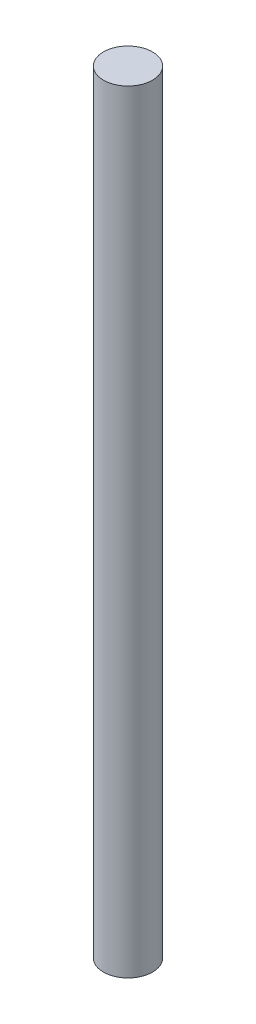
ISO-10303-21;
HEADER;
FILE_DESCRIPTION(('STEP AP214'),'2;1');
FILE_NAME('part.step','',(''),(''),'','','');
FILE_SCHEMA(('AUTOMOTIVE_DESIGN { 1 0 10303 214 1 1 1 1 }'));
ENDSEC;
DATA;
#1=APPLICATION_CONTEXT('core data for automotive mechanical design processes');
#2=APPLICATION_PROTOCOL_DEFINITION('international standard','automotive_design',2000,#1);
#3=PRODUCT_CONTEXT('',#1,'mechanical');
#4=PRODUCT('Part','Part','',(#3));
#5=PRODUCT_RELATED_PRODUCT_CATEGORY('part','',(#4));
#6=PRODUCT_DEFINITION_FORMATION('','',#4);
#7=PRODUCT_DEFINITION_CONTEXT('part definition',#1,'design');
#8=PRODUCT_DEFINITION('design','',#6,#7);
#9=PRODUCT_DEFINITION_SHAPE('','',#8);
#10=(LENGTH_UNIT() NAMED_UNIT(*) SI_UNIT(.MILLI.,.METRE.));
#11=(NAMED_UNIT(*) PLANE_ANGLE_UNIT() SI_UNIT($,.RADIAN.));
#12=(NAMED_UNIT(*) SI_UNIT($,.STERADIAN.) SOLID_ANGLE_UNIT());
#13=UNCERTAINTY_MEASURE_WITH_UNIT(LENGTH_MEASURE(1.E-05),#10,'distance_accuracy_value','');
#14=(GEOMETRIC_REPRESENTATION_CONTEXT(3) GLOBAL_UNCERTAINTY_ASSIGNED_CONTEXT((#13)) GLOBAL_UNIT_ASSIGNED_CONTEXT((#10,
#11,#12)) REPRESENTATION_CONTEXT('',''));
#15=CARTESIAN_POINT('',(0.,0.,0.));
#16=DIRECTION('',(0.,0.,1.));
#17=DIRECTION('',(1.,0.,0.));
#18=AXIS2_PLACEMENT_3D('',#15,#16,#17);
#19=CARTESIAN_POINT('',(0.,300.,0.));
#20=DIRECTION('',(0.,-1.,0.));
#21=DIRECTION('',(0.,0.,-1.));
#22=AXIS2_PLACEMENT_3D('',#19,#20,#21);
#23=CYLINDRICAL_SURFACE('',#22,9.525);
#24=CARTESIAN_POINT('',(0.,300.,0.));
#25=DIRECTION('',(0.,1.,0.));
#26=DIRECTION('',(0.,0.,1.));
#27=AXIS2_PLACEMENT_3D('',#24,#25,#26);
#28=CIRCLE('',#27,9.525);
#29=CARTESIAN_POINT('',(0.,300.,9.525));
#30=VERTEX_POINT('',#29);
#31=EDGE_CURVE('E10',#30,#30,#28,.T.);
#32=ORIENTED_EDGE('',*,*,#31,.F.);
#33=EDGE_LOOP('',(#32));
#34=FACE_BOUND('',#33,.T.);
#35=CARTESIAN_POINT('',(0.,0.,0.));
#36=DIRECTION('',(0.,1.,0.));
#37=DIRECTION('',(0.,0.,1.));
#38=AXIS2_PLACEMENT_3D('',#35,#36,#37);
#39=CIRCLE('',#38,9.525);
#40=CARTESIAN_POINT('',(0.,0.,9.525));
#41=VERTEX_POINT('',#40);
#42=EDGE_CURVE('E40',#41,#41,#39,.T.);
#43=ORIENTED_EDGE('',*,*,#42,.T.);
#44=EDGE_LOOP('',(#43));
#45=FACE_BOUND('',#44,.T.);
#46=ADVANCED_FACE('F37',(#34,#45),#23,.T.);
#47=CARTESIAN_POINT('',(0.,300.,0.));
#48=DIRECTION('',(0.,1.,0.));
#49=DIRECTION('',(0.,0.,1.));
#50=AXIS2_PLACEMENT_3D('',#47,#48,#49);
#51=PLANE('',#50);
#52=ORIENTED_EDGE('',*,*,#31,.T.);
#53=EDGE_LOOP('',(#52));
#54=FACE_BOUND('',#53,.T.);
#55=ADVANCED_FACE('F54',(#54),#51,.T.);
#56=CARTESIAN_POINT('',(0.,0.,0.));
#57=DIRECTION('',(0.,1.,0.));
#58=DIRECTION('',(0.,0.,1.));
#59=AXIS2_PLACEMENT_3D('',#56,#57,#58);
#60=PLANE('',#59);
#61=ORIENTED_EDGE('',*,*,#42,.F.);
#62=EDGE_LOOP('',(#61));
#63=FACE_BOUND('',#62,.T.);
#64=ADVANCED_FACE('F52',(#63),#60,.F.);
#65=CLOSED_SHELL('',(#46,#55,#64));
#66=MANIFOLD_SOLID_BREP('B2',#65);
#67=ADVANCED_BREP_SHAPE_REPRESENTATION('',(#18,#66),#14);
#68=SHAPE_DEFINITION_REPRESENTATION(#9,#67);
ENDSEC;
END-ISO-10303-21;
